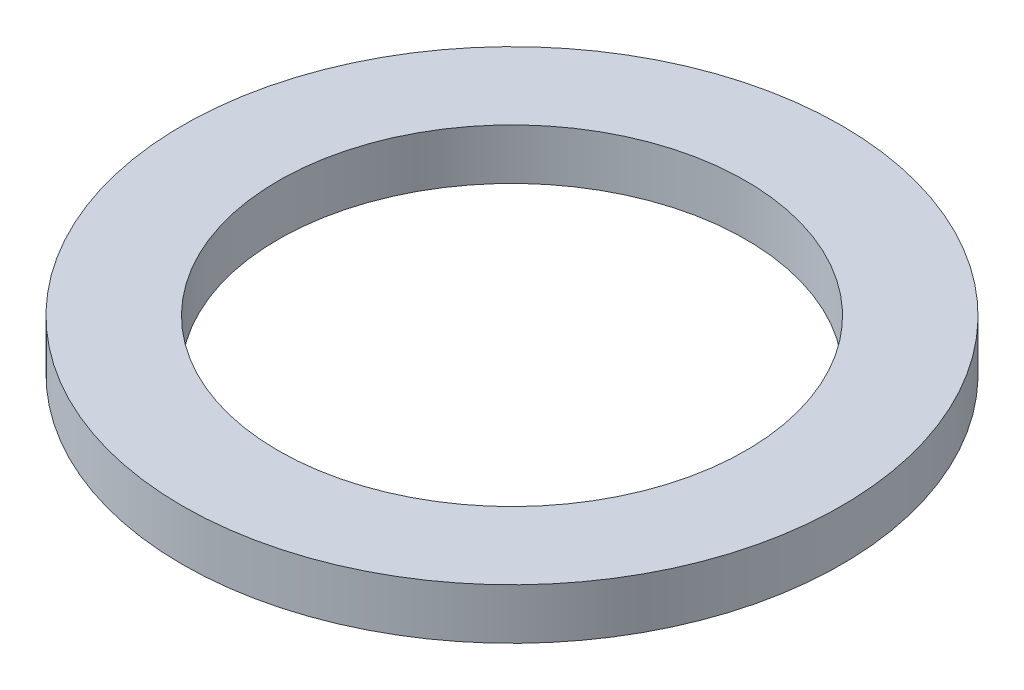
ISO-10303-21;
HEADER;
FILE_DESCRIPTION(('STEP AP214'),'2;1');
FILE_NAME('part.step','',(''),(''),'','','');
FILE_SCHEMA(('AUTOMOTIVE_DESIGN { 1 0 10303 214 1 1 1 1 }'));
ENDSEC;
DATA;
#1=APPLICATION_CONTEXT('core data for automotive mechanical design processes');
#2=APPLICATION_PROTOCOL_DEFINITION('international standard','automotive_design',2000,#1);
#3=PRODUCT_CONTEXT('',#1,'mechanical');
#4=PRODUCT('Part','Part','',(#3));
#5=PRODUCT_RELATED_PRODUCT_CATEGORY('part','',(#4));
#6=PRODUCT_DEFINITION_FORMATION('','',#4);
#7=PRODUCT_DEFINITION_CONTEXT('part definition',#1,'design');
#8=PRODUCT_DEFINITION('design','',#6,#7);
#9=PRODUCT_DEFINITION_SHAPE('','',#8);
#10=(LENGTH_UNIT() NAMED_UNIT(*) SI_UNIT(.MILLI.,.METRE.));
#11=(NAMED_UNIT(*) PLANE_ANGLE_UNIT() SI_UNIT($,.RADIAN.));
#12=(NAMED_UNIT(*) SI_UNIT($,.STERADIAN.) SOLID_ANGLE_UNIT());
#13=UNCERTAINTY_MEASURE_WITH_UNIT(LENGTH_MEASURE(1.E-05),#10,'distance_accuracy_value','');
#14=(GEOMETRIC_REPRESENTATION_CONTEXT(3) GLOBAL_UNCERTAINTY_ASSIGNED_CONTEXT((#13)) GLOBAL_UNIT_ASSIGNED_CONTEXT((#10,
#11,#12)) REPRESENTATION_CONTEXT('',''));
#15=CARTESIAN_POINT('',(0.,0.,0.));
#16=DIRECTION('',(0.,0.,1.));
#17=DIRECTION('',(1.,0.,0.));
#18=AXIS2_PLACEMENT_3D('',#15,#16,#17);
#19=CARTESIAN_POINT('',(0.,3.175,0.));
#20=DIRECTION('',(0.,1.,0.));
#21=DIRECTION('',(0.,0.,1.));
#22=AXIS2_PLACEMENT_3D('',#19,#20,#21);
#23=PLANE('',#22);
#24=CARTESIAN_POINT('',(0.,3.175,0.));
#25=DIRECTION('',(0.,1.,0.));
#26=DIRECTION('',(0.,0.,1.));
#27=AXIS2_PLACEMENT_3D('',#24,#25,#26);
#28=CIRCLE('',#27,20.6375);
#29=CARTESIAN_POINT('',(0.,3.175,20.6375));
#30=VERTEX_POINT('',#29);
#31=EDGE_CURVE('E10',#30,#30,#28,.T.);
#32=ORIENTED_EDGE('',*,*,#31,.T.);
#33=EDGE_LOOP('',(#32));
#34=FACE_BOUND('',#33,.T.);
#35=CARTESIAN_POINT('',(0.,3.175,0.));
#36=DIRECTION('',(0.,1.,0.));
#37=DIRECTION('',(0.,0.,1.));
#38=AXIS2_PLACEMENT_3D('',#35,#36,#37);
#39=CIRCLE('',#38,14.6375);
#40=CARTESIAN_POINT('',(0.,3.175,14.6375));
#41=VERTEX_POINT('',#40);
#42=EDGE_CURVE('E46',#41,#41,#39,.T.);
#43=ORIENTED_EDGE('',*,*,#42,.F.);
#44=EDGE_LOOP('',(#43));
#45=FACE_BOUND('',#44,.T.);
#46=ADVANCED_FACE('F35',(#34,#45),#23,.T.);
#47=CARTESIAN_POINT('',(0.,0.,0.));
#48=DIRECTION('',(0.,1.,0.));
#49=DIRECTION('',(0.,0.,1.));
#50=AXIS2_PLACEMENT_3D('',#47,#48,#49);
#51=PLANE('',#50);
#52=CARTESIAN_POINT('',(0.,0.,0.));
#53=DIRECTION('',(0.,1.,0.));
#54=DIRECTION('',(0.,0.,1.));
#55=AXIS2_PLACEMENT_3D('',#52,#53,#54);
#56=CIRCLE('',#55,20.6375);
#57=CARTESIAN_POINT('',(0.,0.,20.6375));
#58=VERTEX_POINT('',#57);
#59=EDGE_CURVE('E39',#58,#58,#56,.T.);
#60=ORIENTED_EDGE('',*,*,#59,.F.);
#61=EDGE_LOOP('',(#60));
#62=FACE_BOUND('',#61,.T.);
#63=CARTESIAN_POINT('',(0.,0.,0.));
#64=DIRECTION('',(0.,1.,0.));
#65=DIRECTION('',(0.,0.,1.));
#66=AXIS2_PLACEMENT_3D('',#63,#64,#65);
#67=CIRCLE('',#66,14.6375);
#68=CARTESIAN_POINT('',(0.,0.,14.6375));
#69=VERTEX_POINT('',#68);
#70=EDGE_CURVE('E48',#69,#69,#67,.T.);
#71=ORIENTED_EDGE('',*,*,#70,.T.);
#72=EDGE_LOOP('',(#71));
#73=FACE_BOUND('',#72,.T.);
#74=ADVANCED_FACE('F58',(#62,#73),#51,.F.);
#75=CARTESIAN_POINT('',(0.,3.175,0.));
#76=DIRECTION('',(0.,-1.,0.));
#77=DIRECTION('',(0.,0.,-1.));
#78=AXIS2_PLACEMENT_3D('',#75,#76,#77);
#79=CYLINDRICAL_SURFACE('',#78,20.6375);
#80=ORIENTED_EDGE('',*,*,#31,.F.);
#81=EDGE_LOOP('',(#80));
#82=FACE_BOUND('',#81,.T.);
#83=ORIENTED_EDGE('',*,*,#59,.T.);
#84=EDGE_LOOP('',(#83));
#85=FACE_BOUND('',#84,.T.);
#86=ADVANCED_FACE('F37',(#82,#85),#79,.T.);
#87=CARTESIAN_POINT('',(0.,3.175,0.));
#88=DIRECTION('',(0.,-1.,0.));
#89=DIRECTION('',(0.,0.,-1.));
#90=AXIS2_PLACEMENT_3D('',#87,#88,#89);
#91=CYLINDRICAL_SURFACE('',#90,14.6375);
#92=ORIENTED_EDGE('',*,*,#42,.T.);
#93=EDGE_LOOP('',(#92));
#94=FACE_BOUND('',#93,.T.);
#95=ORIENTED_EDGE('',*,*,#70,.F.);
#96=EDGE_LOOP('',(#95));
#97=FACE_BOUND('',#96,.T.);
#98=ADVANCED_FACE('F54',(#94,#97),#91,.F.);
#99=CLOSED_SHELL('',(#46,#74,#86,#98));
#100=MANIFOLD_SOLID_BREP('B2',#99);
#101=ADVANCED_BREP_SHAPE_REPRESENTATION('',(#18,#100),#14);
#102=SHAPE_DEFINITION_REPRESENTATION(#9,#101);
ENDSEC;
END-ISO-10303-21;
